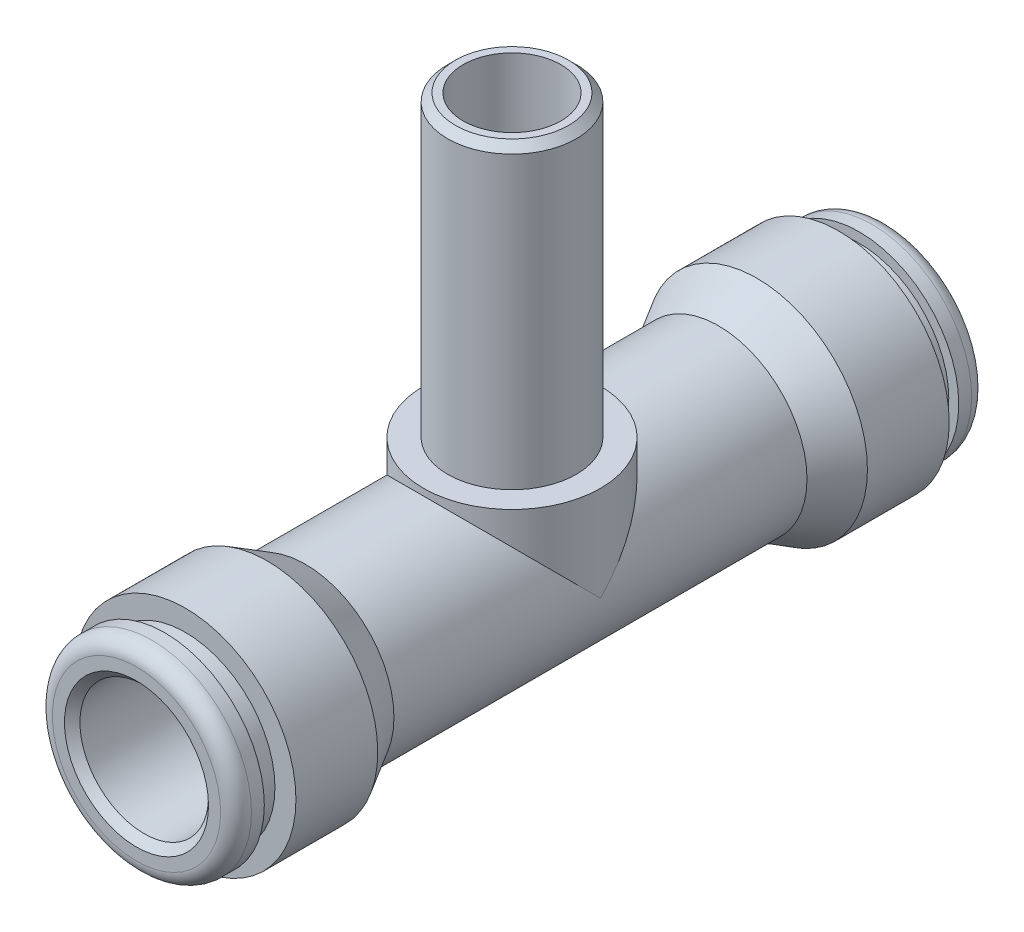
ISO-10303-21;
HEADER;
FILE_DESCRIPTION(('STEP AP214'),'2;1');
FILE_NAME('part.step','',(''),(''),'','','');
FILE_SCHEMA(('AUTOMOTIVE_DESIGN { 1 0 10303 214 1 1 1 1 }'));
ENDSEC;
DATA;
#1=APPLICATION_CONTEXT('core data for automotive mechanical design processes');
#2=APPLICATION_PROTOCOL_DEFINITION('international standard','automotive_design',2000,#1);
#3=PRODUCT_CONTEXT('',#1,'mechanical');
#4=PRODUCT('Part','Part','',(#3));
#5=PRODUCT_RELATED_PRODUCT_CATEGORY('part','',(#4));
#6=PRODUCT_DEFINITION_FORMATION('','',#4);
#7=PRODUCT_DEFINITION_CONTEXT('part definition',#1,'design');
#8=PRODUCT_DEFINITION('design','',#6,#7);
#9=PRODUCT_DEFINITION_SHAPE('','',#8);
#10=(LENGTH_UNIT() NAMED_UNIT(*) SI_UNIT(.MILLI.,.METRE.));
#11=(NAMED_UNIT(*) PLANE_ANGLE_UNIT() SI_UNIT($,.RADIAN.));
#12=(NAMED_UNIT(*) SI_UNIT($,.STERADIAN.) SOLID_ANGLE_UNIT());
#13=UNCERTAINTY_MEASURE_WITH_UNIT(LENGTH_MEASURE(1.E-05),#10,'distance_accuracy_value','');
#14=(GEOMETRIC_REPRESENTATION_CONTEXT(3) GLOBAL_UNCERTAINTY_ASSIGNED_CONTEXT((#13)) GLOBAL_UNIT_ASSIGNED_CONTEXT((#10,
#11,#12)) REPRESENTATION_CONTEXT('',''));
#15=CARTESIAN_POINT('',(0.,0.,0.));
#16=DIRECTION('',(0.,0.,1.));
#17=DIRECTION('',(1.,0.,0.));
#18=AXIS2_PLACEMENT_3D('',#15,#16,#17);
#19=CARTESIAN_POINT('',(0.,4.699,0.));
#20=DIRECTION('',(0.,1.,0.));
#21=DIRECTION('',(0.,0.,1.));
#22=AXIS2_PLACEMENT_3D('',#19,#20,#21);
#23=PLANE('',#22);
#24=CARTESIAN_POINT('',(0.,4.699,0.));
#25=DIRECTION('',(0.,1.,0.));
#26=DIRECTION('',(0.,0.,1.));
#27=AXIS2_PLACEMENT_3D('',#24,#25,#26);
#28=CIRCLE('',#27,4.3688);
#29=CARTESIAN_POINT('',(0.,4.69900000000001,4.36879999999998));
#30=VERTEX_POINT('',#29);
#31=EDGE_CURVE('E87',#30,#30,#28,.T.);
#32=ORIENTED_EDGE('',*,*,#31,.T.);
#33=EDGE_LOOP('',(#32));
#34=FACE_BOUND('',#33,.T.);
#35=CARTESIAN_POINT('',(0.,4.699,0.));
#36=DIRECTION('',(0.,1.,0.));
#37=DIRECTION('',(0.,0.,1.));
#38=AXIS2_PLACEMENT_3D('',#35,#36,#37);
#39=CIRCLE('',#38,3.175);
#40=CARTESIAN_POINT('',(0.,4.69900000000001,3.17499999999998));
#41=VERTEX_POINT('',#40);
#42=EDGE_CURVE('E72',#41,#41,#39,.T.);
#43=ORIENTED_EDGE('',*,*,#42,.F.);
#44=EDGE_LOOP('',(#43));
#45=FACE_BOUND('',#44,.T.);
#46=ADVANCED_FACE('F32',(#34,#45),#23,.T.);
#47=CARTESIAN_POINT('',(0.,4.699,0.));
#48=DIRECTION('',(0.,-1.,0.));
#49=DIRECTION('',(0.,0.,-1.));
#50=AXIS2_PLACEMENT_3D('',#47,#48,#49);
#51=CYLINDRICAL_SURFACE('',#50,2.413);
#52=CARTESIAN_POINT('',(0.,0.,0.));
#53=DIRECTION('',(0.,-0.707106781186549,-0.707106781186546));
#54=DIRECTION('',(0.,-0.707106781186546,0.707106781186549));
#55=AXIS2_PLACEMENT_3D('',#52,#53,#54);
#56=ELLIPSE('',#55,3.41249732600628,2.413);
#57=CARTESIAN_POINT('',(2.413,0.,0.));
#58=VERTEX_POINT('',#57);
#59=CARTESIAN_POINT('',(-2.413,0.,0.));
#60=VERTEX_POINT('',#59);
#61=EDGE_CURVE('E46',#58,#60,#56,.F.);
#62=ORIENTED_EDGE('',*,*,#61,.F.);
#63=CARTESIAN_POINT('',(0.,0.,0.));
#64=DIRECTION('',(0.,-1.,0.));
#65=DIRECTION('',(1.,0.,0.));
#66=AXIS2_PLACEMENT_3D('',#63,#64,#65);
#67=CIRCLE('',#66,2.413);
#68=EDGE_CURVE('E77',#58,#60,#67,.T.);
#69=ORIENTED_EDGE('',*,*,#68,.T.);
#70=EDGE_LOOP('',(#62,#69));
#71=FACE_BOUND('',#70,.T.);
#72=CARTESIAN_POINT('',(0.,19.431,0.));
#73=DIRECTION('',(0.,1.,0.));
#74=DIRECTION('',(0.,0.,1.));
#75=AXIS2_PLACEMENT_3D('',#72,#73,#74);
#76=CIRCLE('',#75,2.413);
#77=CARTESIAN_POINT('',(0.,19.431,2.41299999999993));
#78=VERTEX_POINT('',#77);
#79=EDGE_CURVE('E509',#78,#78,#76,.T.);
#80=ORIENTED_EDGE('',*,*,#79,.T.);
#81=EDGE_LOOP('',(#80));
#82=FACE_BOUND('',#81,.T.);
#83=ADVANCED_FACE('F75',(#71,#82),#51,.F.);
#84=CARTESIAN_POINT('',(0.,0.,0.));
#85=DIRECTION('',(1.,0.,0.));
#86=DIRECTION('',(0.,0.,-1.));
#87=AXIS2_PLACEMENT_3D('',#84,#85,#86);
#88=SPHERICAL_SURFACE('',#87,2.413);
#89=ORIENTED_EDGE('',*,*,#68,.F.);
#90=CARTESIAN_POINT('',(0.,0.,0.));
#91=DIRECTION('',(0.,0.,1.));
#92=DIRECTION('',(1.,0.,0.));
#93=AXIS2_PLACEMENT_3D('',#90,#91,#92);
#94=CIRCLE('',#93,2.413);
#95=EDGE_CURVE('E67',#60,#58,#94,.T.);
#96=ORIENTED_EDGE('',*,*,#95,.F.);
#97=EDGE_LOOP('',(#89,#96));
#98=FACE_BOUND('',#97,.T.);
#99=ADVANCED_FACE('F80',(#98),#88,.F.);
#100=CARTESIAN_POINT('',(0.,0.,0.));
#101=DIRECTION('',(0.,0.,1.));
#102=DIRECTION('',(1.,0.,0.));
#103=AXIS2_PLACEMENT_3D('',#100,#101,#102);
#104=CYLINDRICAL_SURFACE('',#103,4.3688);
#105=CARTESIAN_POINT('',(0.,0.,-10.1981));
#106=DIRECTION('',(0.,0.,1.));
#107=DIRECTION('',(1.,0.,0.));
#108=AXIS2_PLACEMENT_3D('',#105,#106,#107);
#109=CIRCLE('',#108,4.3688);
#110=CARTESIAN_POINT('',(4.3688,0.,-10.1981));
#111=VERTEX_POINT('',#110);
#112=EDGE_CURVE('E98',#111,#111,#109,.T.);
#113=ORIENTED_EDGE('',*,*,#112,.T.);
#114=EDGE_LOOP('',(#113));
#115=FACE_BOUND('',#114,.T.);
#116=CARTESIAN_POINT('',(0.,0.,0.));
#117=DIRECTION('',(0.,0.707106781186546,0.707106781186549));
#118=DIRECTION('',(0.,-0.707106781186549,0.707106781186546));
#119=AXIS2_PLACEMENT_3D('',#116,#117,#118);
#120=ELLIPSE('',#119,6.17841621129557,4.3688);
#121=CARTESIAN_POINT('',(4.3688,0.,0.));
#122=VERTEX_POINT('',#121);
#123=CARTESIAN_POINT('',(-4.3688,0.,0.));
#124=VERTEX_POINT('',#123);
#125=EDGE_CURVE('E53',#122,#124,#120,.T.);
#126=ORIENTED_EDGE('',*,*,#125,.F.);
#127=CARTESIAN_POINT('',(0.,0.,0.));
#128=DIRECTION('',(0.,-0.707106781186546,0.707106781186549));
#129=DIRECTION('',(0.,-0.707106781186549,-0.707106781186546));
#130=AXIS2_PLACEMENT_3D('',#127,#128,#129);
#131=ELLIPSE('',#130,6.17841621129557,4.3688);
#132=EDGE_CURVE('E133',#122,#124,#131,.T.);
#133=ORIENTED_EDGE('',*,*,#132,.T.);
#134=EDGE_LOOP('',(#126,#133));
#135=FACE_BOUND('',#134,.T.);
#136=CARTESIAN_POINT('',(0.,0.,10.1981));
#137=DIRECTION('',(0.,0.,1.));
#138=DIRECTION('',(1.,0.,0.));
#139=AXIS2_PLACEMENT_3D('',#136,#137,#138);
#140=CIRCLE('',#139,4.3688);
#141=CARTESIAN_POINT('',(4.3688,0.,10.1981));
#142=VERTEX_POINT('',#141);
#143=EDGE_CURVE('E543',#142,#142,#140,.T.);
#144=ORIENTED_EDGE('',*,*,#143,.F.);
#145=EDGE_LOOP('',(#144));
#146=FACE_BOUND('',#145,.T.);
#147=ADVANCED_FACE('F216',(#115,#135,#146),#104,.T.);
#148=CARTESIAN_POINT('',(0.,0.,-4.3688));
#149=DIRECTION('',(0.,0.,1.));
#150=DIRECTION('',(1.,0.,0.));
#151=AXIS2_PLACEMENT_3D('',#148,#149,#150);
#152=CYLINDRICAL_SURFACE('',#151,2.413);
#153=CARTESIAN_POINT('',(0.,0.,-4.3688));
#154=DIRECTION('',(0.,0.,1.));
#155=DIRECTION('',(1.,0.,0.));
#156=AXIS2_PLACEMENT_3D('',#153,#154,#155);
#157=CIRCLE('',#156,2.413);
#158=CARTESIAN_POINT('',(2.413,0.,-4.3688));
#159=VERTEX_POINT('',#158);
#160=EDGE_CURVE('E81',#159,#159,#157,.T.);
#161=ORIENTED_EDGE('',*,*,#160,.F.);
#162=EDGE_LOOP('',(#161));
#163=FACE_BOUND('',#162,.T.);
#164=ORIENTED_EDGE('',*,*,#61,.T.);
#165=ORIENTED_EDGE('',*,*,#95,.T.);
#166=EDGE_LOOP('',(#164,#165));
#167=FACE_BOUND('',#166,.T.);
#168=ADVANCED_FACE('F68',(#163,#167),#152,.F.);
#169=CARTESIAN_POINT('',(0.,0.,0.));
#170=DIRECTION('',(0.,0.,1.));
#171=DIRECTION('',(1.,0.,0.));
#172=AXIS2_PLACEMENT_3D('',#169,#170,#171);
#173=CYLINDRICAL_SURFACE('',#172,3.175);
#174=CARTESIAN_POINT('',(0.,0.,-18.161));
#175=DIRECTION('',(0.,0.,1.));
#176=DIRECTION('',(1.,0.,0.));
#177=AXIS2_PLACEMENT_3D('',#174,#175,#176);
#178=CIRCLE('',#177,3.175);
#179=CARTESIAN_POINT('',(3.175,0.,-18.161));
#180=VERTEX_POINT('',#179);
#181=EDGE_CURVE('E85',#180,#180,#178,.T.);
#182=ORIENTED_EDGE('',*,*,#181,.F.);
#183=EDGE_LOOP('',(#182));
#184=FACE_BOUND('',#183,.T.);
#185=CARTESIAN_POINT('',(0.,0.,-4.3688));
#186=DIRECTION('',(0.,0.,1.));
#187=DIRECTION('',(1.,0.,0.));
#188=AXIS2_PLACEMENT_3D('',#185,#186,#187);
#189=CIRCLE('',#188,3.175);
#190=CARTESIAN_POINT('',(3.175,0.,-4.3688));
#191=VERTEX_POINT('',#190);
#192=EDGE_CURVE('E91',#191,#191,#189,.F.);
#193=ORIENTED_EDGE('',*,*,#192,.F.);
#194=EDGE_LOOP('',(#193));
#195=FACE_BOUND('',#194,.T.);
#196=ADVANCED_FACE('F226',(#184,#195),#173,.F.);
#197=CARTESIAN_POINT('',(0.,0.,-12.0898458920267));
#198=DIRECTION('',(0.,0.,-1.));
#199=DIRECTION('',(-1.,0.,0.));
#200=AXIS2_PLACEMENT_3D('',#197,#198,#199);
#201=CONICAL_SURFACE('',#200,5.461,0.5235987755983);
#202=ORIENTED_EDGE('',*,*,#112,.F.);
#203=EDGE_LOOP('',(#202));
#204=FACE_BOUND('',#203,.T.);
#205=CARTESIAN_POINT('',(0.,0.,-12.0898458920267));
#206=DIRECTION('',(0.,0.,1.));
#207=DIRECTION('',(1.,0.,0.));
#208=AXIS2_PLACEMENT_3D('',#205,#206,#207);
#209=CIRCLE('',#208,5.461);
#210=CARTESIAN_POINT('',(5.461,0.,-12.0898458920267));
#211=VERTEX_POINT('',#210);
#212=EDGE_CURVE('E102',#211,#211,#209,.T.);
#213=ORIENTED_EDGE('',*,*,#212,.T.);
#214=EDGE_LOOP('',(#213));
#215=FACE_BOUND('',#214,.T.);
#216=ADVANCED_FACE('F261',(#204,#215),#201,.T.);
#217=CARTESIAN_POINT('',(0.,0.,0.));
#218=DIRECTION('',(0.,0.,1.));
#219=DIRECTION('',(1.,0.,0.));
#220=AXIS2_PLACEMENT_3D('',#217,#218,#219);
#221=CYLINDRICAL_SURFACE('',#220,5.461);
#222=ORIENTED_EDGE('',*,*,#212,.F.);
#223=EDGE_LOOP('',(#222));
#224=FACE_BOUND('',#223,.T.);
#225=CARTESIAN_POINT('',(0.,0.,-16.129));
#226=DIRECTION('',(0.,0.,1.));
#227=DIRECTION('',(1.,0.,0.));
#228=AXIS2_PLACEMENT_3D('',#225,#226,#227);
#229=CIRCLE('',#228,5.461);
#230=CARTESIAN_POINT('',(5.461,0.,-16.129));
#231=VERTEX_POINT('',#230);
#232=EDGE_CURVE('E106',#231,#231,#229,.T.);
#233=ORIENTED_EDGE('',*,*,#232,.T.);
#234=EDGE_LOOP('',(#233));
#235=FACE_BOUND('',#234,.T.);
#236=ADVANCED_FACE('F257',(#224,#235),#221,.T.);
#237=CARTESIAN_POINT('',(0.,5.461,-16.129));
#238=DIRECTION('',(0.,0.,1.));
#239=DIRECTION('',(1.,0.,0.));
#240=AXIS2_PLACEMENT_3D('',#237,#238,#239);
#241=PLANE('',#240);
#242=ORIENTED_EDGE('',*,*,#232,.F.);
#243=EDGE_LOOP('',(#242));
#244=FACE_BOUND('',#243,.T.);
#245=CARTESIAN_POINT('',(0.,0.,-16.129));
#246=DIRECTION('',(0.,0.,1.));
#247=DIRECTION('',(1.,0.,0.));
#248=AXIS2_PLACEMENT_3D('',#245,#246,#247);
#249=CIRCLE('',#248,4.42341);
#250=CARTESIAN_POINT('',(4.42341,0.,-16.129));
#251=VERTEX_POINT('',#250);
#252=EDGE_CURVE('E111',#251,#251,#249,.T.);
#253=ORIENTED_EDGE('',*,*,#252,.T.);
#254=EDGE_LOOP('',(#253));
#255=FACE_BOUND('',#254,.T.);
#256=ADVANCED_FACE('F253',(#244,#255),#241,.F.);
#257=CARTESIAN_POINT('',(0.,0.,0.));
#258=DIRECTION('',(0.,0.,1.));
#259=DIRECTION('',(1.,0.,0.));
#260=AXIS2_PLACEMENT_3D('',#257,#258,#259);
#261=CYLINDRICAL_SURFACE('',#260,4.42341);
#262=ORIENTED_EDGE('',*,*,#252,.F.);
#263=EDGE_LOOP('',(#262));
#264=FACE_BOUND('',#263,.T.);
#265=CARTESIAN_POINT('',(0.,0.,-17.145));
#266=DIRECTION('',(0.,0.,1.));
#267=DIRECTION('',(1.,0.,0.));
#268=AXIS2_PLACEMENT_3D('',#265,#266,#267);
#269=CIRCLE('',#268,4.42341);
#270=CARTESIAN_POINT('',(4.42341,0.,-17.145));
#271=VERTEX_POINT('',#270);
#272=EDGE_CURVE('E114',#271,#271,#269,.T.);
#273=ORIENTED_EDGE('',*,*,#272,.T.);
#274=EDGE_LOOP('',(#273));
#275=FACE_BOUND('',#274,.T.);
#276=ADVANCED_FACE('F249',(#264,#275),#261,.T.);
#277=CARTESIAN_POINT('',(0.,4.9149,-17.145));
#278=DIRECTION('',(0.,0.,-1.));
#279=DIRECTION('',(-1.,0.,0.));
#280=AXIS2_PLACEMENT_3D('',#277,#278,#279);
#281=PLANE('',#280);
#282=ORIENTED_EDGE('',*,*,#272,.F.);
#283=EDGE_LOOP('',(#282));
#284=FACE_BOUND('',#283,.T.);
#285=CARTESIAN_POINT('',(0.,0.,-17.145));
#286=DIRECTION('',(0.,0.,1.));
#287=DIRECTION('',(1.,0.,0.));
#288=AXIS2_PLACEMENT_3D('',#285,#286,#287);
#289=CIRCLE('',#288,4.9149);
#290=CARTESIAN_POINT('',(4.9149,0.,-17.145));
#291=VERTEX_POINT('',#290);
#292=EDGE_CURVE('E117',#291,#291,#289,.T.);
#293=ORIENTED_EDGE('',*,*,#292,.T.);
#294=EDGE_LOOP('',(#293));
#295=FACE_BOUND('',#294,.T.);
#296=ADVANCED_FACE('F245',(#284,#295),#281,.F.);
#297=CARTESIAN_POINT('',(0.,0.,0.));
#298=DIRECTION('',(0.,0.,1.));
#299=DIRECTION('',(1.,0.,0.));
#300=AXIS2_PLACEMENT_3D('',#297,#298,#299);
#301=CYLINDRICAL_SURFACE('',#300,4.9149);
#302=ORIENTED_EDGE('',*,*,#292,.F.);
#303=EDGE_LOOP('',(#302));
#304=FACE_BOUND('',#303,.T.);
#305=CARTESIAN_POINT('',(0.,0.,-17.78));
#306=DIRECTION('',(0.,0.,1.));
#307=DIRECTION('',(1.,0.,0.));
#308=AXIS2_PLACEMENT_3D('',#305,#306,#307);
#309=CIRCLE('',#308,4.9149);
#310=CARTESIAN_POINT('',(4.9149,0.,-17.78));
#311=VERTEX_POINT('',#310);
#312=EDGE_CURVE('E120',#311,#311,#309,.T.);
#313=ORIENTED_EDGE('',*,*,#312,.T.);
#314=EDGE_LOOP('',(#313));
#315=FACE_BOUND('',#314,.T.);
#316=ADVANCED_FACE('F241',(#304,#315),#301,.T.);
#317=CARTESIAN_POINT('',(0.,0.,-17.78));
#318=DIRECTION('',(0.,0.,1.));
#319=DIRECTION('',(1.,0.,0.));
#320=AXIS2_PLACEMENT_3D('',#317,#318,#319);
#321=TOROIDAL_SURFACE('',#320,4.1529,0.761999999999999);
#322=ORIENTED_EDGE('',*,*,#312,.F.);
#323=EDGE_LOOP('',(#322));
#324=FACE_BOUND('',#323,.T.);
#325=CARTESIAN_POINT('',(0.,0.,-18.542));
#326=DIRECTION('',(0.,0.,1.));
#327=DIRECTION('',(1.,0.,0.));
#328=AXIS2_PLACEMENT_3D('',#325,#326,#327);
#329=CIRCLE('',#328,4.1529);
#330=CARTESIAN_POINT('',(4.1529,0.,-18.542));
#331=VERTEX_POINT('',#330);
#332=EDGE_CURVE('E123',#331,#331,#329,.T.);
#333=ORIENTED_EDGE('',*,*,#332,.T.);
#334=EDGE_LOOP('',(#333));
#335=FACE_BOUND('',#334,.T.);
#336=ADVANCED_FACE('F237',(#324,#335),#321,.T.);
#337=CARTESIAN_POINT('',(0.,4.1529,-18.542));
#338=DIRECTION('',(0.,0.,1.));
#339=DIRECTION('',(1.,0.,0.));
#340=AXIS2_PLACEMENT_3D('',#337,#338,#339);
#341=PLANE('',#340);
#342=ORIENTED_EDGE('',*,*,#332,.F.);
#343=EDGE_LOOP('',(#342));
#344=FACE_BOUND('',#343,.T.);
#345=CARTESIAN_POINT('',(0.,0.,-18.542));
#346=DIRECTION('',(0.,0.,1.));
#347=DIRECTION('',(1.,0.,0.));
#348=AXIS2_PLACEMENT_3D('',#345,#346,#347);
#349=CIRCLE('',#348,3.556);
#350=CARTESIAN_POINT('',(3.556,0.,-18.542));
#351=VERTEX_POINT('',#350);
#352=EDGE_CURVE('E126',#351,#351,#349,.T.);
#353=ORIENTED_EDGE('',*,*,#352,.T.);
#354=EDGE_LOOP('',(#353));
#355=FACE_BOUND('',#354,.T.);
#356=ADVANCED_FACE('F233',(#344,#355),#341,.F.);
#357=CARTESIAN_POINT('',(0.,0.,-18.161));
#358=DIRECTION('',(0.,0.,-1.));
#359=DIRECTION('',(-1.,0.,0.));
#360=AXIS2_PLACEMENT_3D('',#357,#358,#359);
#361=CONICAL_SURFACE('',#360,3.175,0.785398163397449);
#362=ORIENTED_EDGE('',*,*,#352,.F.);
#363=EDGE_LOOP('',(#362));
#364=FACE_BOUND('',#363,.T.);
#365=ORIENTED_EDGE('',*,*,#181,.T.);
#366=EDGE_LOOP('',(#365));
#367=FACE_BOUND('',#366,.T.);
#368=ADVANCED_FACE('F230',(#364,#367),#361,.F.);
#369=CARTESIAN_POINT('',(0.,0.,-4.3688));
#370=DIRECTION('',(0.,0.,1.));
#371=DIRECTION('',(1.,0.,0.));
#372=AXIS2_PLACEMENT_3D('',#369,#370,#371);
#373=PLANE('',#372);
#374=ORIENTED_EDGE('',*,*,#192,.T.);
#375=EDGE_LOOP('',(#374));
#376=FACE_BOUND('',#375,.T.);
#377=ORIENTED_EDGE('',*,*,#160,.T.);
#378=EDGE_LOOP('',(#377));
#379=FACE_BOUND('',#378,.T.);
#380=ADVANCED_FACE('F170',(#376,#379),#373,.F.);
#381=CARTESIAN_POINT('',(0.,0.,4.3688));
#382=DIRECTION('',(0.,0.,-1.));
#383=DIRECTION('',(1.,0.,0.));
#384=AXIS2_PLACEMENT_3D('',#381,#382,#383);
#385=PLANE('',#384);
#386=CARTESIAN_POINT('',(0.,0.,4.3688));
#387=DIRECTION('',(0.,0.,1.));
#388=DIRECTION('',(1.,0.,0.));
#389=AXIS2_PLACEMENT_3D('',#386,#387,#388);
#390=CIRCLE('',#389,2.413);
#391=CARTESIAN_POINT('',(0.,2.41300000000001,4.3688));
#392=VERTEX_POINT('',#391);
#393=EDGE_CURVE('E78',#392,#392,#390,.T.);
#394=ORIENTED_EDGE('',*,*,#393,.F.);
#395=EDGE_LOOP('',(#394));
#396=FACE_BOUND('',#395,.T.);
#397=CARTESIAN_POINT('',(0.,0.,4.3688));
#398=DIRECTION('',(0.,0.,1.));
#399=DIRECTION('',(1.,0.,0.));
#400=AXIS2_PLACEMENT_3D('',#397,#398,#399);
#401=CIRCLE('',#400,3.175);
#402=CARTESIAN_POINT('',(3.175,0.,4.3688));
#403=VERTEX_POINT('',#402);
#404=EDGE_CURVE('E546',#403,#403,#401,.F.);
#405=ORIENTED_EDGE('',*,*,#404,.F.);
#406=EDGE_LOOP('',(#405));
#407=FACE_BOUND('',#406,.T.);
#408=ADVANCED_FACE('F166',(#396,#407),#385,.F.);
#409=CARTESIAN_POINT('',(0.,0.,18.161));
#410=DIRECTION('',(0.,0.,1.));
#411=DIRECTION('',(-1.,0.,0.));
#412=AXIS2_PLACEMENT_3D('',#409,#410,#411);
#413=CONICAL_SURFACE('',#412,3.175,0.785398163397449);
#414=CARTESIAN_POINT('',(0.,0.,18.542));
#415=DIRECTION('',(0.,0.,1.));
#416=DIRECTION('',(1.,0.,0.));
#417=AXIS2_PLACEMENT_3D('',#414,#415,#416);
#418=CIRCLE('',#417,3.556);
#419=CARTESIAN_POINT('',(3.556,0.,18.542));
#420=VERTEX_POINT('',#419);
#421=EDGE_CURVE('E519',#420,#420,#418,.T.);
#422=ORIENTED_EDGE('',*,*,#421,.T.);
#423=EDGE_LOOP('',(#422));
#424=FACE_BOUND('',#423,.T.);
#425=CARTESIAN_POINT('',(0.,0.,18.161));
#426=DIRECTION('',(0.,0.,1.));
#427=DIRECTION('',(1.,0.,0.));
#428=AXIS2_PLACEMENT_3D('',#425,#426,#427);
#429=CIRCLE('',#428,3.175);
#430=CARTESIAN_POINT('',(3.175,0.,18.161));
#431=VERTEX_POINT('',#430);
#432=EDGE_CURVE('E516',#431,#431,#429,.T.);
#433=ORIENTED_EDGE('',*,*,#432,.F.);
#434=EDGE_LOOP('',(#433));
#435=FACE_BOUND('',#434,.T.);
#436=ADVANCED_FACE('F169',(#424,#435),#413,.F.);
#437=CARTESIAN_POINT('',(0.,4.1529,18.542));
#438=DIRECTION('',(0.,0.,-1.));
#439=DIRECTION('',(1.,0.,0.));
#440=AXIS2_PLACEMENT_3D('',#437,#438,#439);
#441=PLANE('',#440);
#442=CARTESIAN_POINT('',(0.,0.,18.542));
#443=DIRECTION('',(0.,0.,1.));
#444=DIRECTION('',(1.,0.,0.));
#445=AXIS2_PLACEMENT_3D('',#442,#443,#444);
#446=CIRCLE('',#445,4.1529);
#447=CARTESIAN_POINT('',(4.1529,0.,18.542));
#448=VERTEX_POINT('',#447);
#449=EDGE_CURVE('E522',#448,#448,#446,.T.);
#450=ORIENTED_EDGE('',*,*,#449,.T.);
#451=EDGE_LOOP('',(#450));
#452=FACE_BOUND('',#451,.T.);
#453=ORIENTED_EDGE('',*,*,#421,.F.);
#454=EDGE_LOOP('',(#453));
#455=FACE_BOUND('',#454,.T.);
#456=ADVANCED_FACE('F174',(#452,#455),#441,.F.);
#457=CARTESIAN_POINT('',(0.,0.,17.78));
#458=DIRECTION('',(0.,0.,-1.));
#459=DIRECTION('',(1.,0.,0.));
#460=AXIS2_PLACEMENT_3D('',#457,#458,#459);
#461=TOROIDAL_SURFACE('',#460,4.1529,0.761999999999999);
#462=CARTESIAN_POINT('',(0.,0.,17.78));
#463=DIRECTION('',(0.,0.,1.));
#464=DIRECTION('',(1.,0.,0.));
#465=AXIS2_PLACEMENT_3D('',#462,#463,#464);
#466=CIRCLE('',#465,4.9149);
#467=CARTESIAN_POINT('',(4.9149,0.,17.78));
#468=VERTEX_POINT('',#467);
#469=EDGE_CURVE('E525',#468,#468,#466,.T.);
#470=ORIENTED_EDGE('',*,*,#469,.T.);
#471=EDGE_LOOP('',(#470));
#472=FACE_BOUND('',#471,.T.);
#473=ORIENTED_EDGE('',*,*,#449,.F.);
#474=EDGE_LOOP('',(#473));
#475=FACE_BOUND('',#474,.T.);
#476=ADVANCED_FACE('F178',(#472,#475),#461,.T.);
#477=CARTESIAN_POINT('',(0.,0.,0.));
#478=DIRECTION('',(0.,0.,-1.));
#479=DIRECTION('',(1.,0.,0.));
#480=AXIS2_PLACEMENT_3D('',#477,#478,#479);
#481=CYLINDRICAL_SURFACE('',#480,4.9149);
#482=CARTESIAN_POINT('',(0.,0.,17.145));
#483=DIRECTION('',(0.,0.,1.));
#484=DIRECTION('',(1.,0.,0.));
#485=AXIS2_PLACEMENT_3D('',#482,#483,#484);
#486=CIRCLE('',#485,4.9149);
#487=CARTESIAN_POINT('',(4.9149,0.,17.145));
#488=VERTEX_POINT('',#487);
#489=EDGE_CURVE('E528',#488,#488,#486,.T.);
#490=ORIENTED_EDGE('',*,*,#489,.T.);
#491=EDGE_LOOP('',(#490));
#492=FACE_BOUND('',#491,.T.);
#493=ORIENTED_EDGE('',*,*,#469,.F.);
#494=EDGE_LOOP('',(#493));
#495=FACE_BOUND('',#494,.T.);
#496=ADVANCED_FACE('F182',(#492,#495),#481,.T.);
#497=CARTESIAN_POINT('',(0.,4.9149,17.145));
#498=DIRECTION('',(0.,0.,1.));
#499=DIRECTION('',(-1.,0.,0.));
#500=AXIS2_PLACEMENT_3D('',#497,#498,#499);
#501=PLANE('',#500);
#502=CARTESIAN_POINT('',(0.,0.,17.145));
#503=DIRECTION('',(0.,0.,1.));
#504=DIRECTION('',(1.,0.,0.));
#505=AXIS2_PLACEMENT_3D('',#502,#503,#504);
#506=CIRCLE('',#505,4.42341);
#507=CARTESIAN_POINT('',(4.42341,0.,17.145));
#508=VERTEX_POINT('',#507);
#509=EDGE_CURVE('E531',#508,#508,#506,.T.);
#510=ORIENTED_EDGE('',*,*,#509,.T.);
#511=EDGE_LOOP('',(#510));
#512=FACE_BOUND('',#511,.T.);
#513=ORIENTED_EDGE('',*,*,#489,.F.);
#514=EDGE_LOOP('',(#513));
#515=FACE_BOUND('',#514,.T.);
#516=ADVANCED_FACE('F186',(#512,#515),#501,.F.);
#517=CARTESIAN_POINT('',(0.,0.,0.));
#518=DIRECTION('',(0.,0.,-1.));
#519=DIRECTION('',(1.,0.,0.));
#520=AXIS2_PLACEMENT_3D('',#517,#518,#519);
#521=CYLINDRICAL_SURFACE('',#520,4.42341);
#522=CARTESIAN_POINT('',(0.,0.,16.129));
#523=DIRECTION('',(0.,0.,1.));
#524=DIRECTION('',(1.,0.,0.));
#525=AXIS2_PLACEMENT_3D('',#522,#523,#524);
#526=CIRCLE('',#525,4.42341);
#527=CARTESIAN_POINT('',(4.42341,0.,16.129));
#528=VERTEX_POINT('',#527);
#529=EDGE_CURVE('E534',#528,#528,#526,.T.);
#530=ORIENTED_EDGE('',*,*,#529,.T.);
#531=EDGE_LOOP('',(#530));
#532=FACE_BOUND('',#531,.T.);
#533=ORIENTED_EDGE('',*,*,#509,.F.);
#534=EDGE_LOOP('',(#533));
#535=FACE_BOUND('',#534,.T.);
#536=ADVANCED_FACE('F190',(#532,#535),#521,.T.);
#537=CARTESIAN_POINT('',(0.,5.461,16.129));
#538=DIRECTION('',(0.,0.,-1.));
#539=DIRECTION('',(1.,0.,0.));
#540=AXIS2_PLACEMENT_3D('',#537,#538,#539);
#541=PLANE('',#540);
#542=CARTESIAN_POINT('',(0.,0.,16.129));
#543=DIRECTION('',(0.,0.,1.));
#544=DIRECTION('',(1.,0.,0.));
#545=AXIS2_PLACEMENT_3D('',#542,#543,#544);
#546=CIRCLE('',#545,5.461);
#547=CARTESIAN_POINT('',(5.461,0.,16.129));
#548=VERTEX_POINT('',#547);
#549=EDGE_CURVE('E537',#548,#548,#546,.T.);
#550=ORIENTED_EDGE('',*,*,#549,.T.);
#551=EDGE_LOOP('',(#550));
#552=FACE_BOUND('',#551,.T.);
#553=ORIENTED_EDGE('',*,*,#529,.F.);
#554=EDGE_LOOP('',(#553));
#555=FACE_BOUND('',#554,.T.);
#556=ADVANCED_FACE('F194',(#552,#555),#541,.F.);
#557=CARTESIAN_POINT('',(0.,0.,0.));
#558=DIRECTION('',(0.,0.,-1.));
#559=DIRECTION('',(1.,0.,0.));
#560=AXIS2_PLACEMENT_3D('',#557,#558,#559);
#561=CYLINDRICAL_SURFACE('',#560,5.461);
#562=CARTESIAN_POINT('',(0.,0.,12.0898458920267));
#563=DIRECTION('',(0.,0.,1.));
#564=DIRECTION('',(1.,0.,0.));
#565=AXIS2_PLACEMENT_3D('',#562,#563,#564);
#566=CIRCLE('',#565,5.461);
#567=CARTESIAN_POINT('',(5.461,0.,12.0898458920267));
#568=VERTEX_POINT('',#567);
#569=EDGE_CURVE('E540',#568,#568,#566,.T.);
#570=ORIENTED_EDGE('',*,*,#569,.T.);
#571=EDGE_LOOP('',(#570));
#572=FACE_BOUND('',#571,.T.);
#573=ORIENTED_EDGE('',*,*,#549,.F.);
#574=EDGE_LOOP('',(#573));
#575=FACE_BOUND('',#574,.T.);
#576=ADVANCED_FACE('F198',(#572,#575),#561,.T.);
#577=CARTESIAN_POINT('',(0.,0.,12.0898458920267));
#578=DIRECTION('',(0.,0.,1.));
#579=DIRECTION('',(-1.,0.,0.));
#580=AXIS2_PLACEMENT_3D('',#577,#578,#579);
#581=CONICAL_SURFACE('',#580,5.461,0.5235987755983);
#582=ORIENTED_EDGE('',*,*,#143,.T.);
#583=EDGE_LOOP('',(#582));
#584=FACE_BOUND('',#583,.T.);
#585=ORIENTED_EDGE('',*,*,#569,.F.);
#586=EDGE_LOOP('',(#585));
#587=FACE_BOUND('',#586,.T.);
#588=ADVANCED_FACE('F202',(#584,#587),#581,.T.);
#589=CARTESIAN_POINT('',(0.,0.,0.));
#590=DIRECTION('',(0.,0.,-1.));
#591=DIRECTION('',(1.,0.,0.));
#592=AXIS2_PLACEMENT_3D('',#589,#590,#591);
#593=CYLINDRICAL_SURFACE('',#592,3.175);
#594=ORIENTED_EDGE('',*,*,#432,.T.);
#595=EDGE_LOOP('',(#594));
#596=FACE_BOUND('',#595,.T.);
#597=ORIENTED_EDGE('',*,*,#404,.T.);
#598=EDGE_LOOP('',(#597));
#599=FACE_BOUND('',#598,.T.);
#600=ADVANCED_FACE('F162',(#596,#599),#593,.F.);
#601=CARTESIAN_POINT('',(0.,0.,4.3688));
#602=DIRECTION('',(0.,0.,-1.));
#603=DIRECTION('',(1.,0.,0.));
#604=AXIS2_PLACEMENT_3D('',#601,#602,#603);
#605=CYLINDRICAL_SURFACE('',#604,2.413);
#606=CARTESIAN_POINT('',(-2.413,0.,3.64195612823658));
#607=CARTESIAN_POINT('',(-2.41301248673578,0.0621173958207917,3.64193407850862));
#608=CARTESIAN_POINT('',(-2.41060186105892,0.124222230464948,3.64354477008072));
#609=CARTESIAN_POINT('',(-2.40103314738837,0.247859175907632,3.64986473878716));
#610=CARTESIAN_POINT('',(-2.39387877224335,0.309391696483393,3.65457159258735));
#611=CARTESIAN_POINT('',(-2.37498600281798,0.431016897195451,3.66687516531723));
#612=CARTESIAN_POINT('',(-2.36327935997673,0.491116554916906,3.67445185821795));
#613=CARTESIAN_POINT('',(-2.33545167367641,0.60988420565902,3.69220141465455));
#614=CARTESIAN_POINT('',(-2.31932994822329,0.668551975971155,3.70237467926412));
#615=CARTESIAN_POINT('',(-2.26472566199872,0.841517004144022,3.73621059632102));
#616=CARTESIAN_POINT('',(-2.21993143546884,0.953231330385974,3.76323977150058));
#617=CARTESIAN_POINT('',(-2.11506237814946,1.16764227176382,3.82316137456981));
#618=CARTESIAN_POINT('',(-2.05495837145171,1.27032115964669,3.85606496113253));
#619=CARTESIAN_POINT('',(-1.91408311135434,1.47506163973587,3.92804833112511));
#620=CARTESIAN_POINT('',(-1.83183575414254,1.57600885462763,3.96741615816785));
#621=CARTESIAN_POINT('',(-1.65207789981161,1.76354525612841,4.04557325991854));
#622=CARTESIAN_POINT('',(-1.55456259497997,1.85012990237206,4.08436234815952));
#623=CARTESIAN_POINT('',(-1.33669713556447,2.01393778695711,4.16102182041541));
#624=CARTESIAN_POINT('',(-1.21509876462321,2.08969256369091,4.1985191031839));
#625=CARTESIAN_POINT('',(-0.958417198321535,2.21914770062173,4.2644285039477));
#626=CARTESIAN_POINT('',(-0.823344150145416,2.27286450309773,4.29284739171197));
#627=CARTESIAN_POINT('',(-0.555522801472945,2.35197615779225,4.33527636798843));
#628=CARTESIAN_POINT('',(-0.423527402530051,2.37936637963603,4.35029395110763));
#629=CARTESIAN_POINT('',(-0.15603504820413,2.41170692588374,4.36806376115812));
#630=CARTESIAN_POINT('',(-0.0205408067382526,2.41667414654268,4.37082522333632));
#631=CARTESIAN_POINT('',(0.234727288644383,2.40459088699469,4.36416020269079));
#632=CARTESIAN_POINT('',(0.354650625790152,2.38980950674068,4.35598965292023));
#633=CARTESIAN_POINT('',(0.589991808398479,2.34283527941936,4.33039650199895));
#634=CARTESIAN_POINT('',(0.705409380494983,2.31064137768411,4.31297334042321));
#635=CARTESIAN_POINT('',(0.930118962308908,2.22976883223983,4.27019056254797));
#636=CARTESIAN_POINT('',(1.03933319013303,2.18091928400641,4.24474888113703));
#637=CARTESIAN_POINT('',(1.24822414542837,2.06847566651747,4.18808784273965));
#638=CARTESIAN_POINT('',(1.34789782147227,2.00487690202201,4.15686664655245));
#639=CARTESIAN_POINT('',(1.54642897085391,1.85689870149653,4.08744303220581));
#640=CARTESIAN_POINT('',(1.64402845509369,1.77101449513533,4.04885073250016));
#641=CARTESIAN_POINT('',(1.8242060808964,1.58482001398949,3.97093748237345));
#642=CARTESIAN_POINT('',(1.90676528789532,1.48449183579887,3.93161568121639));
#643=CARTESIAN_POINT('',(2.0618956932604,1.26144017409996,3.85269152705692));
#644=CARTESIAN_POINT('',(2.13290233761196,1.13751431346815,3.81338158423188));
#645=CARTESIAN_POINT('',(2.25246689735957,0.877135332253131,3.74401149556779));
#646=CARTESIAN_POINT('',(2.3010902260886,0.740720129720759,3.71392448371552));
#647=CARTESIAN_POINT('',(2.36211104711037,0.503013177495732,3.67528320305557));
#648=CARTESIAN_POINT('',(2.38107417217734,0.404011402993649,3.66294121693167));
#649=CARTESIAN_POINT('',(2.40016569349333,0.253662901192848,3.65043451311361));
#650=CARTESIAN_POINT('',(2.40497086514173,0.203124809142827,3.64726635120081));
#651=CARTESIAN_POINT('',(2.41139078354432,0.101730031726049,3.6430226849934));
#652=CARTESIAN_POINT('',(2.41300367562408,0.0508731783637888,3.64194839721894));
#653=CARTESIAN_POINT('',(2.413,0.,3.64195612823658));
#654=B_SPLINE_CURVE_WITH_KNOTS('',3,(#606,#607,#608,#609,#610,#611,#612,#613,#614,#615,#616,
#617,#618,#619,#620,#621,#622,#623,#624,#625,#626,#627,#628,#629,#630,#631,#632,#633,#634,#635,
#636,#637,#638,#639,#640,#641,#642,#643,#644,#645,#646,#647,#648,#649,#650,#651,#652,#653),
.UNSPECIFIED.,.F.,.F.,(4,2,2,2,2,2,2,2,2,2,2,2,2,2,2,2,2,2,2,2,2,2,2,4),(0.,0.186264098740619,
0.372382583687746,0.557225552518655,0.742097090005952,1.1104662232642,1.47954268078721,
1.88597532071791,2.29253620026759,2.73444556815916,3.17602463032688,3.58061734874668,
3.98490514616013,4.34651129614504,4.70813935089101,5.07359571015184,5.4391685682414,
5.84434165860227,6.25002135829335,6.69216165913226,7.13300150911176,7.436570538123,
7.58903364495665,7.74158530497325),.UNSPECIFIED.);
#655=CARTESIAN_POINT('',(2.413,0.,3.64195612823658));
#656=VERTEX_POINT('',#655);
#657=EDGE_CURVE('E141',#392,#656,#654,.T.);
#658=ORIENTED_EDGE('',*,*,#657,.T.);
#659=CARTESIAN_POINT('',(0.,0.,3.64195612823658));
#660=DIRECTION('',(0.,0.,-1.));
#661=DIRECTION('',(-1.,0.,0.));
#662=AXIS2_PLACEMENT_3D('',#659,#660,#661);
#663=CIRCLE('',#662,2.413);
#664=CARTESIAN_POINT('',(-2.413,0.,3.64195612823658));
#665=VERTEX_POINT('',#664);
#666=EDGE_CURVE('E137',#656,#665,#663,.T.);
#667=ORIENTED_EDGE('',*,*,#666,.T.);
#668=EDGE_CURVE('E140',#665,#392,#654,.T.);
#669=ORIENTED_EDGE('',*,*,#668,.T.);
#670=ORIENTED_EDGE('',*,*,#393,.T.);
#671=EDGE_LOOP('',(#658,#667,#669,#670));
#672=FACE_BOUND('',#671,.T.);
#673=ADVANCED_FACE('F156',(#672),#605,.F.);
#674=CARTESIAN_POINT('',(0.,4.699,0.));
#675=DIRECTION('',(0.,-1.,0.));
#676=DIRECTION('',(0.,0.,-1.));
#677=AXIS2_PLACEMENT_3D('',#674,#675,#676);
#678=CYLINDRICAL_SURFACE('',#677,4.3688);
#679=ORIENTED_EDGE('',*,*,#668,.F.);
#680=CARTESIAN_POINT('',(0.,0.,0.));
#681=DIRECTION('',(0.,1.,0.));
#682=DIRECTION('',(1.,0.,0.));
#683=AXIS2_PLACEMENT_3D('',#680,#681,#682);
#684=CIRCLE('',#683,4.3688);
#685=EDGE_CURVE('E82',#665,#656,#684,.T.);
#686=ORIENTED_EDGE('',*,*,#685,.T.);
#687=ORIENTED_EDGE('',*,*,#657,.F.);
#688=EDGE_LOOP('',(#679,#686,#687));
#689=FACE_BOUND('',#688,.T.);
#690=ADVANCED_FACE('F161',(#689),#678,.T.);
#691=CARTESIAN_POINT('',(0.,0.,0.));
#692=DIRECTION('',(1.,0.,0.));
#693=DIRECTION('',(0.,0.,1.));
#694=AXIS2_PLACEMENT_3D('',#691,#692,#693);
#695=SPHERICAL_SURFACE('',#694,4.3688);
#696=ORIENTED_EDGE('',*,*,#666,.F.);
#697=ORIENTED_EDGE('',*,*,#685,.F.);
#698=EDGE_LOOP('',(#696,#697));
#699=FACE_BOUND('',#698,.T.);
#700=ADVANCED_FACE('F223',(#699),#695,.T.);
#701=ORIENTED_EDGE('',*,*,#132,.F.);
#702=ORIENTED_EDGE('',*,*,#125,.T.);
#703=EDGE_LOOP('',(#701,#702));
#704=FACE_BOUND('',#703,.T.);
#705=ORIENTED_EDGE('',*,*,#31,.F.);
#706=EDGE_LOOP('',(#705));
#707=FACE_BOUND('',#706,.T.);
#708=ADVANCED_FACE('F152',(#704,#707),#678,.T.);
#709=CARTESIAN_POINT('',(0.,28.4112561210691,0.));
#710=DIRECTION('',(0.,-1.,0.));
#711=DIRECTION('',(0.,0.,-1.));
#712=AXIS2_PLACEMENT_3D('',#709,#710,#711);
#713=CYLINDRICAL_SURFACE('',#712,3.175);
#714=CARTESIAN_POINT('',(0.,19.05,0.));
#715=DIRECTION('',(0.,1.,0.));
#716=DIRECTION('',(0.,0.,1.));
#717=AXIS2_PLACEMENT_3D('',#714,#715,#716);
#718=CIRCLE('',#717,3.175);
#719=CARTESIAN_POINT('',(0.,19.05,3.17499999999993));
#720=VERTEX_POINT('',#719);
#721=EDGE_CURVE('E11',#720,#720,#718,.F.);
#722=ORIENTED_EDGE('',*,*,#721,.T.);
#723=EDGE_LOOP('',(#722));
#724=FACE_BOUND('',#723,.T.);
#725=ORIENTED_EDGE('',*,*,#42,.T.);
#726=EDGE_LOOP('',(#725));
#727=FACE_BOUND('',#726,.T.);
#728=ADVANCED_FACE('F164',(#724,#727),#713,.T.);
#729=CARTESIAN_POINT('',(0.,19.431,0.));
#730=DIRECTION('',(0.,1.,0.));
#731=DIRECTION('',(0.,0.,1.));
#732=AXIS2_PLACEMENT_3D('',#729,#730,#731);
#733=PLANE('',#732);
#734=CARTESIAN_POINT('',(0.,19.431,0.));
#735=DIRECTION('',(0.,1.,0.));
#736=DIRECTION('',(0.,0.,1.));
#737=AXIS2_PLACEMENT_3D('',#734,#735,#736);
#738=CIRCLE('',#737,2.79400000000002);
#739=CARTESIAN_POINT('',(0.,19.431,2.79399999999995));
#740=VERTEX_POINT('',#739);
#741=EDGE_CURVE('E40',#740,#740,#738,.T.);
#742=ORIENTED_EDGE('',*,*,#741,.T.);
#743=EDGE_LOOP('',(#742));
#744=FACE_BOUND('',#743,.T.);
#745=ORIENTED_EDGE('',*,*,#79,.F.);
#746=EDGE_LOOP('',(#745));
#747=FACE_BOUND('',#746,.T.);
#748=ADVANCED_FACE('F396',(#744,#747),#733,.T.);
#749=CARTESIAN_POINT('',(0.,19.431,0.));
#750=DIRECTION('',(0.,-1.,0.));
#751=DIRECTION('',(0.,0.,-1.));
#752=AXIS2_PLACEMENT_3D('',#749,#750,#751);
#753=CONICAL_SURFACE('',#752,2.79400000000001,0.785398163397435);
#754=ORIENTED_EDGE('',*,*,#721,.F.);
#755=EDGE_LOOP('',(#754));
#756=FACE_BOUND('',#755,.T.);
#757=ORIENTED_EDGE('',*,*,#741,.F.);
#758=EDGE_LOOP('',(#757));
#759=FACE_BOUND('',#758,.T.);
#760=ADVANCED_FACE('F34',(#756,#759),#753,.T.);
#761=CLOSED_SHELL('',(#46,#83,#99,#147,#168,#196,#216,#236,#256,#276,#296,#316,#336,#356,#368,
#380,#408,#436,#456,#476,#496,#516,#536,#556,#576,#588,#600,#673,#690,#700,#708,#728,#748,#760));
#762=MANIFOLD_SOLID_BREP('B2',#761);
#763=ADVANCED_BREP_SHAPE_REPRESENTATION('',(#18,#762),#14);
#764=SHAPE_DEFINITION_REPRESENTATION(#9,#763);
ENDSEC;
END-ISO-10303-21;
